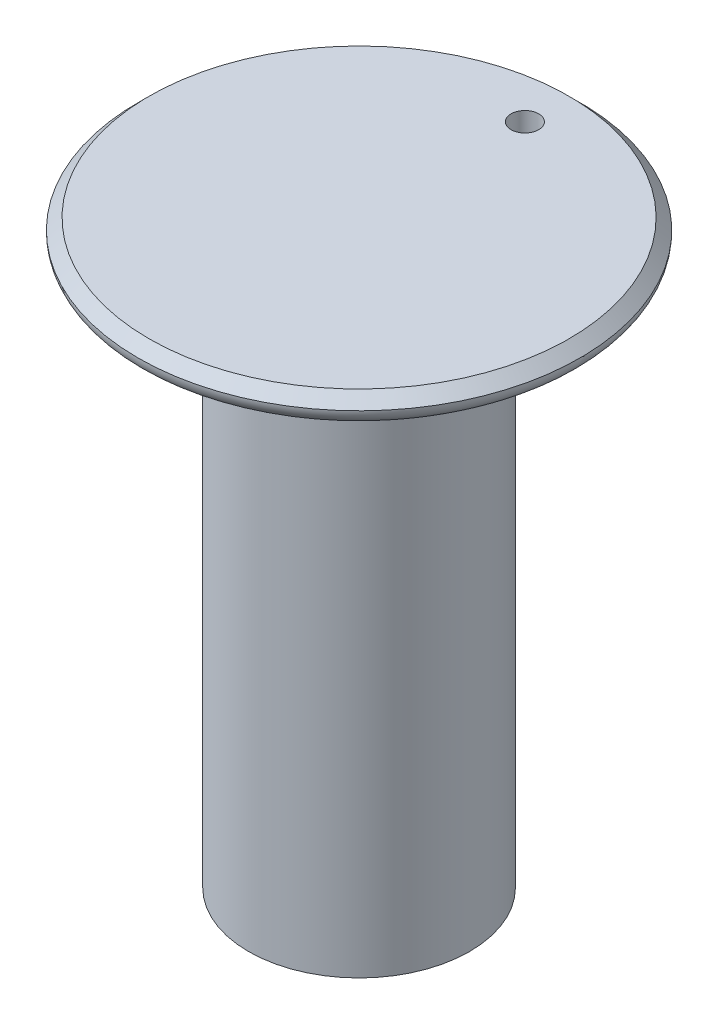
ISO-10303-21;
HEADER;
FILE_DESCRIPTION(('STEP AP214'),'2;1');
FILE_NAME('part.step','',(''),(''),'','','');
FILE_SCHEMA(('AUTOMOTIVE_DESIGN { 1 0 10303 214 1 1 1 1 }'));
ENDSEC;
DATA;
#1=APPLICATION_CONTEXT('core data for automotive mechanical design processes');
#2=APPLICATION_PROTOCOL_DEFINITION('international standard','automotive_design',2000,#1);
#3=PRODUCT_CONTEXT('',#1,'mechanical');
#4=PRODUCT('Part','Part','',(#3));
#5=PRODUCT_RELATED_PRODUCT_CATEGORY('part','',(#4));
#6=PRODUCT_DEFINITION_FORMATION('','',#4);
#7=PRODUCT_DEFINITION_CONTEXT('part definition',#1,'design');
#8=PRODUCT_DEFINITION('design','',#6,#7);
#9=PRODUCT_DEFINITION_SHAPE('','',#8);
#10=(LENGTH_UNIT() NAMED_UNIT(*) SI_UNIT(.MILLI.,.METRE.));
#11=(NAMED_UNIT(*) PLANE_ANGLE_UNIT() SI_UNIT($,.RADIAN.));
#12=(NAMED_UNIT(*) SI_UNIT($,.STERADIAN.) SOLID_ANGLE_UNIT());
#13=UNCERTAINTY_MEASURE_WITH_UNIT(LENGTH_MEASURE(1.E-05),#10,'distance_accuracy_value','');
#14=(GEOMETRIC_REPRESENTATION_CONTEXT(3) GLOBAL_UNCERTAINTY_ASSIGNED_CONTEXT((#13)) GLOBAL_UNIT_ASSIGNED_CONTEXT((#10,
#11,#12)) REPRESENTATION_CONTEXT('',''));
#15=CARTESIAN_POINT('',(0.,0.,0.));
#16=DIRECTION('',(0.,0.,1.));
#17=DIRECTION('',(1.,0.,0.));
#18=AXIS2_PLACEMENT_3D('',#15,#16,#17);
#19=CARTESIAN_POINT('',(0.,50.,0.));
#20=DIRECTION('',(0.,-1.,0.));
#21=DIRECTION('',(0.,0.,-1.));
#22=AXIS2_PLACEMENT_3D('',#19,#20,#21);
#23=CYLINDRICAL_SURFACE('',#22,20.);
#24=CARTESIAN_POINT('',(0.,50.,0.));
#25=DIRECTION('',(0.,1.,0.));
#26=DIRECTION('',(0.,0.,1.));
#27=AXIS2_PLACEMENT_3D('',#24,#25,#26);
#28=CIRCLE('',#27,20.);
#29=CARTESIAN_POINT('',(0.,50.,20.));
#30=VERTEX_POINT('',#29);
#31=EDGE_CURVE('E50',#30,#30,#28,.T.);
#32=ORIENTED_EDGE('',*,*,#31,.F.);
#33=EDGE_LOOP('',(#32));
#34=FACE_BOUND('',#33,.T.);
#35=CARTESIAN_POINT('',(0.,-50.,0.));
#36=DIRECTION('',(0.,1.,0.));
#37=DIRECTION('',(0.,0.,1.));
#38=AXIS2_PLACEMENT_3D('',#35,#36,#37);
#39=CIRCLE('',#38,20.);
#40=CARTESIAN_POINT('',(0.,-50.,20.));
#41=VERTEX_POINT('',#40);
#42=EDGE_CURVE('E59',#41,#41,#39,.T.);
#43=ORIENTED_EDGE('',*,*,#42,.T.);
#44=EDGE_LOOP('',(#43));
#45=FACE_BOUND('',#44,.T.);
#46=ADVANCED_FACE('F34',(#34,#45),#23,.T.);
#47=CARTESIAN_POINT('',(0.,-50.,0.));
#48=DIRECTION('',(0.,1.,0.));
#49=DIRECTION('',(0.,0.,1.));
#50=AXIS2_PLACEMENT_3D('',#47,#48,#49);
#51=PLANE('',#50);
#52=ORIENTED_EDGE('',*,*,#42,.F.);
#53=EDGE_LOOP('',(#52));
#54=FACE_BOUND('',#53,.T.);
#55=ADVANCED_FACE('F72',(#54),#51,.F.);
#56=CARTESIAN_POINT('',(0.,55.,0.));
#57=DIRECTION('',(0.,1.,0.));
#58=DIRECTION('',(0.,0.,1.));
#59=AXIS2_PLACEMENT_3D('',#56,#57,#58);
#60=PLANE('',#59);
#61=CARTESIAN_POINT('',(0.,55.,-30.));
#62=DIRECTION('',(0.,1.,0.));
#63=DIRECTION('',(0.,0.,1.));
#64=AXIS2_PLACEMENT_3D('',#61,#62,#63);
#65=CIRCLE('',#64,2.5);
#66=CARTESIAN_POINT('',(0.,55.,-27.5));
#67=VERTEX_POINT('',#66);
#68=EDGE_CURVE('E55',#67,#67,#65,.T.);
#69=ORIENTED_EDGE('',*,*,#68,.F.);
#70=EDGE_LOOP('',(#69));
#71=FACE_BOUND('',#70,.T.);
#72=CARTESIAN_POINT('',(0.,55.,0.));
#73=DIRECTION('',(0.,1.,0.));
#74=DIRECTION('',(0.,0.,1.));
#75=AXIS2_PLACEMENT_3D('',#72,#73,#74);
#76=CIRCLE('',#75,38.);
#77=CARTESIAN_POINT('',(0.,55.,38.));
#78=VERTEX_POINT('',#77);
#79=EDGE_CURVE('E45',#78,#78,#76,.T.);
#80=ORIENTED_EDGE('',*,*,#79,.T.);
#81=EDGE_LOOP('',(#80));
#82=FACE_BOUND('',#81,.T.);
#83=ADVANCED_FACE('F77',(#71,#82),#60,.T.);
#84=CARTESIAN_POINT('',(0.,50.,0.));
#85=DIRECTION('',(0.,1.,0.));
#86=DIRECTION('',(0.,0.,1.));
#87=AXIS2_PLACEMENT_3D('',#84,#85,#86);
#88=PLANE('',#87);
#89=CARTESIAN_POINT('',(0.,50.,0.));
#90=DIRECTION('',(0.,1.,0.));
#91=DIRECTION('',(0.,0.,1.));
#92=AXIS2_PLACEMENT_3D('',#89,#90,#91);
#93=CIRCLE('',#92,37.);
#94=CARTESIAN_POINT('',(0.,50.,37.));
#95=VERTEX_POINT('',#94);
#96=EDGE_CURVE('E10',#95,#95,#93,.F.);
#97=ORIENTED_EDGE('',*,*,#96,.T.);
#98=EDGE_LOOP('',(#97));
#99=FACE_BOUND('',#98,.T.);
#100=CARTESIAN_POINT('',(0.,50.,-30.));
#101=DIRECTION('',(0.,1.,0.));
#102=DIRECTION('',(0.,0.,1.));
#103=AXIS2_PLACEMENT_3D('',#100,#101,#102);
#104=CIRCLE('',#103,2.5);
#105=CARTESIAN_POINT('',(0.,50.,-27.5));
#106=VERTEX_POINT('',#105);
#107=EDGE_CURVE('E53',#106,#106,#104,.T.);
#108=ORIENTED_EDGE('',*,*,#107,.T.);
#109=EDGE_LOOP('',(#108));
#110=FACE_BOUND('',#109,.T.);
#111=ORIENTED_EDGE('',*,*,#31,.T.);
#112=EDGE_LOOP('',(#111));
#113=FACE_BOUND('',#112,.T.);
#114=ADVANCED_FACE('F68',(#99,#110,#113),#88,.F.);
#115=CARTESIAN_POINT('',(0.,55.,0.));
#116=DIRECTION('',(0.,-1.,0.));
#117=DIRECTION('',(0.,0.,-1.));
#118=AXIS2_PLACEMENT_3D('',#115,#116,#117);
#119=CONICAL_SURFACE('',#118,38.,0.78539816339744);
#120=CARTESIAN_POINT('',(0.,53.,0.));
#121=DIRECTION('',(0.,1.,0.));
#122=DIRECTION('',(0.,0.,1.));
#123=AXIS2_PLACEMENT_3D('',#120,#121,#122);
#124=CIRCLE('',#123,40.);
#125=CARTESIAN_POINT('',(0.,53.,40.));
#126=VERTEX_POINT('',#125);
#127=EDGE_CURVE('E41',#126,#126,#124,.F.);
#128=ORIENTED_EDGE('',*,*,#127,.F.);
#129=EDGE_LOOP('',(#128));
#130=FACE_BOUND('',#129,.T.);
#131=ORIENTED_EDGE('',*,*,#79,.F.);
#132=EDGE_LOOP('',(#131));
#133=FACE_BOUND('',#132,.T.);
#134=ADVANCED_FACE('F85',(#130,#133),#119,.T.);
#135=CARTESIAN_POINT('',(0.,-50.,-30.));
#136=DIRECTION('',(0.,1.,0.));
#137=DIRECTION('',(0.,0.,1.));
#138=AXIS2_PLACEMENT_3D('',#135,#136,#137);
#139=CYLINDRICAL_SURFACE('',#138,2.5);
#140=ORIENTED_EDGE('',*,*,#68,.T.);
#141=EDGE_LOOP('',(#140));
#142=FACE_BOUND('',#141,.T.);
#143=ORIENTED_EDGE('',*,*,#107,.F.);
#144=EDGE_LOOP('',(#143));
#145=FACE_BOUND('',#144,.T.);
#146=ADVANCED_FACE('F87',(#142,#145),#139,.F.);
#147=CARTESIAN_POINT('',(0.,53.,0.));
#148=DIRECTION('',(0.,1.,0.));
#149=DIRECTION('',(0.,0.,1.));
#150=AXIS2_PLACEMENT_3D('',#147,#148,#149);
#151=TOROIDAL_SURFACE('',#150,37.,3.);
#152=ORIENTED_EDGE('',*,*,#96,.F.);
#153=EDGE_LOOP('',(#152));
#154=FACE_BOUND('',#153,.T.);
#155=ORIENTED_EDGE('',*,*,#127,.T.);
#156=EDGE_LOOP('',(#155));
#157=FACE_BOUND('',#156,.T.);
#158=ADVANCED_FACE('F36',(#154,#157),#151,.T.);
#159=CLOSED_SHELL('',(#46,#55,#83,#114,#134,#146,#158));
#160=MANIFOLD_SOLID_BREP('B2',#159);
#161=ADVANCED_BREP_SHAPE_REPRESENTATION('',(#18,#160),#14);
#162=SHAPE_DEFINITION_REPRESENTATION(#9,#161);
ENDSEC;
END-ISO-10303-21;
